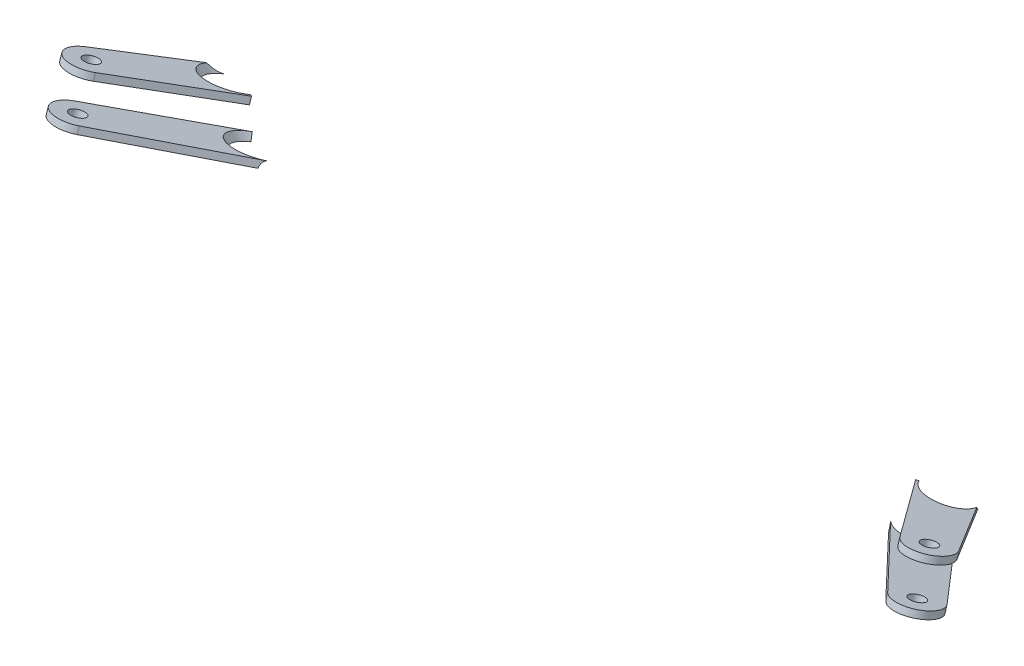
ISO-10303-21;
HEADER;
FILE_DESCRIPTION(('STEP AP214'),'2;1');
FILE_NAME('part.step','',(''),(''),'','','');
FILE_SCHEMA(('AUTOMOTIVE_DESIGN { 1 0 10303 214 1 1 1 1 }'));
ENDSEC;
DATA;
#1=APPLICATION_CONTEXT('core data for automotive mechanical design processes');
#2=APPLICATION_PROTOCOL_DEFINITION('international standard','automotive_design',2000,#1);
#3=PRODUCT_CONTEXT('',#1,'mechanical');
#4=PRODUCT('Part','Part','',(#3));
#5=PRODUCT_RELATED_PRODUCT_CATEGORY('part','',(#4));
#6=PRODUCT_DEFINITION_FORMATION('','',#4);
#7=PRODUCT_DEFINITION_CONTEXT('part definition',#1,'design');
#8=PRODUCT_DEFINITION('design','',#6,#7);
#9=PRODUCT_DEFINITION_SHAPE('','',#8);
#10=(LENGTH_UNIT() NAMED_UNIT(*) SI_UNIT(.MILLI.,.METRE.));
#11=(NAMED_UNIT(*) PLANE_ANGLE_UNIT() SI_UNIT($,.RADIAN.));
#12=(NAMED_UNIT(*) SI_UNIT($,.STERADIAN.) SOLID_ANGLE_UNIT());
#13=UNCERTAINTY_MEASURE_WITH_UNIT(LENGTH_MEASURE(1.E-05),#10,'distance_accuracy_value','');
#14=(GEOMETRIC_REPRESENTATION_CONTEXT(3) GLOBAL_UNCERTAINTY_ASSIGNED_CONTEXT((#13)) GLOBAL_UNIT_ASSIGNED_CONTEXT((#10,
#11,#12)) REPRESENTATION_CONTEXT('',''));
#15=CARTESIAN_POINT('',(0.,0.,0.));
#16=DIRECTION('',(0.,0.,1.));
#17=DIRECTION('',(1.,0.,0.));
#18=AXIS2_PLACEMENT_3D('',#15,#16,#17);
#19=CARTESIAN_POINT('',(-235.249767530379,266.790494678215,-675.844391099445));
#20=DIRECTION('',(0.0180337567061333,0.953754896880129,-0.300043963939017));
#21=DIRECTION('',(0.,0.300092765448664,0.953910023076271));
#22=AXIS2_PLACEMENT_3D('',#19,#20,#21);
#23=PLANE('',#22);
#24=CARTESIAN_POINT('',(-182.899239072118,248.763703608572,-730.));
#25=DIRECTION('',(-0.0180337567061333,-0.953754896880129,0.300043963939017));
#26=DIRECTION('',(-0.90053147748498,0.145880488564538,0.409587525585059));
#27=AXIS2_PLACEMENT_3D('',#24,#25,#26);
#28=ELLIPSE('',#27,15.7430407277131,12.7);
#29=CARTESIAN_POINT('',(-195.899982354414,247.510508125763,-734.764946946639));
#30=VERTEX_POINT('',#29);
#31=CARTESIAN_POINT('',(-176.589048516861,251.966171986454,-719.44099292264));
#32=VERTEX_POINT('',#31);
#33=EDGE_CURVE('E55',#30,#32,#28,.F.);
#34=ORIENTED_EDGE('',*,*,#33,.T.);
#35=DIRECTION('',(0.677029918290957,-0.23247307188389,-0.698274129971753));
#36=VECTOR('',#35,1.);
#37=CARTESIAN_POINT('',(-174.234426061505,251.157660721981,-721.869499997447));
#38=LINE('',#37,#36);
#39=CARTESIAN_POINT('',(-226.420953376511,269.077049493598,-668.045435546764));
#40=VERTEX_POINT('',#39);
#41=EDGE_CURVE('E95',#40,#32,#38,.T.);
#42=ORIENTED_EDGE('',*,*,#41,.F.);
#43=CARTESIAN_POINT('',(-235.249767530379,266.790494678215,-675.844391099445));
#44=DIRECTION('',(0.0180337567061333,0.953754896880129,-0.300043963939017));
#45=DIRECTION('',(0.,0.300092765448664,0.953910023076271));
#46=AXIS2_PLACEMENT_3D('',#43,#44,#45);
#47=CIRCLE('',#46,11.9999999999999);
#48=CARTESIAN_POINT('',(-244.332821935667,264.593936031197,-683.372555070879));
#49=VERTEX_POINT('',#48);
#50=EDGE_CURVE('E101',#49,#40,#47,.T.);
#51=ORIENTED_EDGE('',*,*,#50,.F.);
#52=DIRECTION('',(-0.653257284645626,0.23842306049508,0.718616284453381));
#53=VECTOR('',#52,1.);
#54=CARTESIAN_POINT('',(-197.012615797196,247.323208806299,-735.427191910088));
#55=LINE('',#54,#53);
#56=CARTESIAN_POINT('',(-197.012615797196,247.323208806299,-735.427191910088));
#57=VERTEX_POINT('',#56);
#58=EDGE_CURVE('E120',#57,#49,#55,.T.);
#59=ORIENTED_EDGE('',*,*,#58,.F.);
#60=DIRECTION('',(-0.850453631926347,-0.143164298654907,-0.506194234986862));
#61=VECTOR('',#60,1.);
#62=CARTESIAN_POINT('',(-174.234426061505,251.157660721981,-721.869499997447));
#63=LINE('',#62,#61);
#64=EDGE_CURVE('E49',#30,#57,#63,.T.);
#65=ORIENTED_EDGE('',*,*,#64,.F.);
#66=EDGE_LOOP('',(#34,#42,#51,#59,#65));
#67=FACE_BOUND('',#66,.T.);
#68=CARTESIAN_POINT('',(-235.249767530379,266.790494678215,-675.844391099445));
#69=DIRECTION('',(0.0180337567061333,0.953754896880129,-0.300043963939017));
#70=DIRECTION('',(0.,-0.300092765448664,-0.953910023076271));
#71=AXIS2_PLACEMENT_3D('',#68,#69,#70);
#72=CIRCLE('',#71,4.20000000000006);
#73=CARTESIAN_POINT('',(-235.249767530379,265.530105063331,-679.850813196365));
#74=VERTEX_POINT('',#73);
#75=EDGE_CURVE('E108',#74,#74,#72,.T.);
#76=ORIENTED_EDGE('',*,*,#75,.T.);
#77=EDGE_LOOP('',(#76));
#78=FACE_BOUND('',#77,.T.);
#79=ADVANCED_FACE('F46',(#67,#78),#23,.F.);
#80=CARTESIAN_POINT('',(-235.180337567061,270.462451031204,-676.99956036061));
#81=DIRECTION('',(0.0180337567061333,0.953754896880129,-0.300043963939017));
#82=DIRECTION('',(0.,0.300092765448664,0.953910023076271));
#83=AXIS2_PLACEMENT_3D('',#80,#81,#82);
#84=PLANE('',#83);
#85=DIRECTION('',(-0.653257284645626,0.23842306049508,0.718616284453381));
#86=VECTOR('',#85,1.);
#87=CARTESIAN_POINT('',(-196.943185833878,250.995165159287,-736.582361171253));
#88=LINE('',#87,#86);
#89=CARTESIAN_POINT('',(-196.943185833878,250.995165159287,-736.582361171253));
#90=VERTEX_POINT('',#89);
#91=CARTESIAN_POINT('',(-244.263391972348,268.265892384185,-684.527724332044));
#92=VERTEX_POINT('',#91);
#93=EDGE_CURVE('E113',#90,#92,#88,.T.);
#94=ORIENTED_EDGE('',*,*,#93,.T.);
#95=CARTESIAN_POINT('',(-235.180337567061,270.462451031204,-676.99956036061));
#96=DIRECTION('',(0.0180337567061333,0.953754896880129,-0.300043963939017));
#97=DIRECTION('',(0.,0.300092765448664,0.953910023076271));
#98=AXIS2_PLACEMENT_3D('',#95,#96,#97);
#99=CIRCLE('',#98,11.9999999999999);
#100=CARTESIAN_POINT('',(-226.351523413192,272.749005846586,-669.200604807929));
#101=VERTEX_POINT('',#100);
#102=EDGE_CURVE('E132',#92,#101,#99,.T.);
#103=ORIENTED_EDGE('',*,*,#102,.T.);
#104=DIRECTION('',(0.677029918290957,-0.23247307188389,-0.698274129971753));
#105=VECTOR('',#104,1.);
#106=CARTESIAN_POINT('',(-174.164996098186,254.829617074969,-723.024669258612));
#107=LINE('',#106,#105);
#108=CARTESIAN_POINT('',(-174.164996098186,254.829617074969,-723.024669258612));
#109=VERTEX_POINT('',#108);
#110=EDGE_CURVE('E123',#101,#109,#107,.T.);
#111=ORIENTED_EDGE('',*,*,#110,.T.);
#112=CARTESIAN_POINT('',(-185.369599059717,252.847090109373,-730.));
#113=DIRECTION('',(-0.0180337567061333,-0.953754896880129,0.300043963939017));
#114=DIRECTION('',(-0.90053147748498,0.145880488564538,0.409587525585059));
#115=AXIS2_PLACEMENT_3D('',#112,#113,#114);
#116=ELLIPSE('',#115,15.7430407277131,12.7);
#117=EDGE_CURVE('E90',#90,#109,#116,.F.);
#118=ORIENTED_EDGE('',*,*,#117,.F.);
#119=EDGE_LOOP('',(#94,#103,#111,#118));
#120=FACE_BOUND('',#119,.T.);
#121=CARTESIAN_POINT('',(-235.180337567061,270.462451031204,-676.99956036061));
#122=DIRECTION('',(0.0180337567061333,0.953754896880129,-0.300043963939017));
#123=DIRECTION('',(0.,-0.300092765448664,-0.953910023076271));
#124=AXIS2_PLACEMENT_3D('',#121,#122,#123);
#125=CIRCLE('',#124,4.20000000000006);
#126=CARTESIAN_POINT('',(-235.180337567061,269.202061416319,-681.005982457531));
#127=VERTEX_POINT('',#126);
#128=EDGE_CURVE('E111',#127,#127,#125,.T.);
#129=ORIENTED_EDGE('',*,*,#128,.F.);
#130=EDGE_LOOP('',(#129));
#131=FACE_BOUND('',#130,.T.);
#132=ADVANCED_FACE('F138',(#120,#131),#84,.T.);
#133=CARTESIAN_POINT('',(-174.234426061505,251.157660721981,-721.869499997447));
#134=DIRECTION('',(-0.525740814054178,0.264302062549315,0.808542525888297));
#135=DIRECTION('',(-0.838354450962558,0.,-0.54512550348637));
#136=AXIS2_PLACEMENT_3D('',#133,#134,#135);
#137=PLANE('',#136);
#138=CARTESIAN_POINT('',(-185.653325327252,253.31607601288,-730.));
#139=DIRECTION('',(0.525740814054178,-0.264302062549315,-0.808542525888297));
#140=DIRECTION('',(-0.294873210239745,0.834944720807768,-0.464668810098274));
#141=AXIS2_PLACEMENT_3D('',#138,#139,#140);
#142=ELLIPSE('',#141,25.4879247678671,12.7);
#143=EDGE_CURVE('E106',#90,#30,#142,.F.);
#144=ORIENTED_EDGE('',*,*,#143,.T.);
#145=ORIENTED_EDGE('',*,*,#64,.T.);
#146=DIRECTION('',(0.0180337567061333,0.953754896880129,-0.300043963939017));
#147=VECTOR('',#146,1.);
#148=CARTESIAN_POINT('',(-197.012615797196,247.323208806299,-735.427191910088));
#149=LINE('',#148,#147);
#150=EDGE_CURVE('E62',#57,#90,#149,.T.);
#151=ORIENTED_EDGE('',*,*,#150,.T.);
#152=EDGE_LOOP('',(#144,#145,#151));
#153=FACE_BOUND('',#152,.T.);
#154=ADVANCED_FACE('F136',(#153),#137,.F.);
#155=CARTESIAN_POINT('',(-197.012615797196,247.323208806299,-735.427191910088));
#156=DIRECTION('',(0.756921200440632,0.183046553918215,0.627346997619482));
#157=DIRECTION('',(-0.63812866232523,0.,0.769929743755242));
#158=AXIS2_PLACEMENT_3D('',#155,#156,#157);
#159=PLANE('',#158);
#160=ORIENTED_EDGE('',*,*,#93,.F.);
#161=ORIENTED_EDGE('',*,*,#150,.F.);
#162=ORIENTED_EDGE('',*,*,#58,.T.);
#163=DIRECTION('',(0.0180337567061333,0.953754896880129,-0.300043963939017));
#164=VECTOR('',#163,1.);
#165=CARTESIAN_POINT('',(-244.332821935667,264.593936031197,-683.372555070879));
#166=LINE('',#165,#164);
#167=EDGE_CURVE('E128',#49,#92,#166,.T.);
#168=ORIENTED_EDGE('',*,*,#167,.T.);
#169=EDGE_LOOP('',(#160,#161,#162,#168));
#170=FACE_BOUND('',#169,.T.);
#171=ADVANCED_FACE('F140',(#170),#159,.F.);
#172=CARTESIAN_POINT('',(-235.249767530379,266.790494678215,-675.844391099445));
#173=DIRECTION('',(0.0180337567061333,0.953754896880129,-0.300043963939017));
#174=DIRECTION('',(0.,0.300092765448664,0.953910023076271));
#175=AXIS2_PLACEMENT_3D('',#172,#173,#174);
#176=CYLINDRICAL_SURFACE('',#175,11.9999999999999);
#177=ORIENTED_EDGE('',*,*,#102,.F.);
#178=ORIENTED_EDGE('',*,*,#167,.F.);
#179=ORIENTED_EDGE('',*,*,#50,.T.);
#180=DIRECTION('',(0.0180337567061333,0.953754896880129,-0.300043963939017));
#181=VECTOR('',#180,1.);
#182=CARTESIAN_POINT('',(-226.420953376511,269.077049493598,-668.045435546764));
#183=LINE('',#182,#181);
#184=EDGE_CURVE('E97',#40,#101,#183,.T.);
#185=ORIENTED_EDGE('',*,*,#184,.T.);
#186=EDGE_LOOP('',(#177,#178,#179,#185));
#187=FACE_BOUND('',#186,.T.);
#188=ADVANCED_FACE('F142',(#187),#176,.T.);
#189=CARTESIAN_POINT('',(-174.234426061505,251.157660721981,-721.869499997447));
#190=DIRECTION('',(-0.735734512822393,-0.19054623461523,-0.649912962723435));
#191=DIRECTION('',(0.662042762940673,0.,-0.749466063299653));
#192=AXIS2_PLACEMENT_3D('',#189,#190,#191);
#193=PLANE('',#192);
#194=CARTESIAN_POINT('',(-154.106174529814,201.170149770705,-730.));
#195=DIRECTION('',(0.735734512822393,0.19054623461523,0.649912962723435));
#196=DIRECTION('',(-0.366171047210188,0.91917573151594,0.145033578102215));
#197=AXIS2_PLACEMENT_3D('',#194,#195,#196);
#198=ELLIPSE('',#197,58.310072412481,12.7);
#199=EDGE_CURVE('E12',#32,#109,#198,.F.);
#200=ORIENTED_EDGE('',*,*,#199,.T.);
#201=ORIENTED_EDGE('',*,*,#110,.F.);
#202=ORIENTED_EDGE('',*,*,#184,.F.);
#203=ORIENTED_EDGE('',*,*,#41,.T.);
#204=EDGE_LOOP('',(#200,#201,#202,#203));
#205=FACE_BOUND('',#204,.T.);
#206=ADVANCED_FACE('F96',(#205),#193,.F.);
#207=CARTESIAN_POINT('',(-235.249767530379,266.790494678215,-675.844391099445));
#208=DIRECTION('',(0.0180337567061333,0.953754896880129,-0.300043963939017));
#209=DIRECTION('',(0.,0.300092765448664,0.953910023076271));
#210=AXIS2_PLACEMENT_3D('',#207,#208,#209);
#211=CYLINDRICAL_SURFACE('',#210,4.20000000000006);
#212=ORIENTED_EDGE('',*,*,#75,.F.);
#213=EDGE_LOOP('',(#212));
#214=FACE_BOUND('',#213,.T.);
#215=ORIENTED_EDGE('',*,*,#128,.T.);
#216=EDGE_LOOP('',(#215));
#217=FACE_BOUND('',#216,.T.);
#218=ADVANCED_FACE('F149',(#214,#217),#211,.F.);
#219=CARTESIAN_POINT('',(-105.,120.,-730.));
#220=DIRECTION('',(-0.517624253172971,0.855608048423531,0.));
#221=DIRECTION('',(-0.855608048423532,-0.517624253172971,0.));
#222=AXIS2_PLACEMENT_3D('',#219,#220,#221);
#223=CYLINDRICAL_SURFACE('',#222,12.7);
#224=ORIENTED_EDGE('',*,*,#143,.F.);
#225=ORIENTED_EDGE('',*,*,#117,.T.);
#226=ORIENTED_EDGE('',*,*,#199,.F.);
#227=ORIENTED_EDGE('',*,*,#33,.F.);
#228=EDGE_LOOP('',(#224,#225,#226,#227));
#229=FACE_BOUND('',#228,.T.);
#230=ADVANCED_FACE('F87',(#229),#223,.F.);
#231=CLOSED_SHELL('',(#79,#132,#154,#171,#188,#206,#218,#230));
#232=MANIFOLD_SOLID_BREP('B2',#231);
#233=CARTESIAN_POINT('',(-234.75023246962,293.209505321791,-684.155608900555));
#234=DIRECTION('',(0.0180337567061333,0.953754896880127,-0.300043963939024));
#235=DIRECTION('',(0.,0.300092765448671,0.953910023076269));
#236=AXIS2_PLACEMENT_3D('',#233,#234,#235);
#237=PLANE('',#236);
#238=DIRECTION('',(0.575310780054983,-0.255335033847021,-0.777059538801801));
#239=VECTOR('',#238,1.);
#240=CARTESIAN_POINT('',(-210.728681196313,276.289830752568,-736.49468433631));
#241=LINE('',#240,#239);
#242=CARTESIAN_POINT('',(-244.563065381471,291.306242630484,-690.795330383567));
#243=VERTEX_POINT('',#242);
#244=CARTESIAN_POINT('',(-215.736454754987,278.512386066029,-729.7307954143));
#245=VERTEX_POINT('',#244);
#246=EDGE_CURVE('E277',#243,#245,#241,.T.);
#247=ORIENTED_EDGE('',*,*,#246,.F.);
#248=CARTESIAN_POINT('',(-234.75023246962,293.209505321791,-684.155608900555));
#249=DIRECTION('',(-0.0180337567061333,-0.953754896880127,0.300043963939024));
#250=DIRECTION('',(0.,0.300092765448671,0.953910023076269));
#251=AXIS2_PLACEMENT_3D('',#248,#249,#250);
#252=CIRCLE('',#251,11.9999999999999);
#253=CARTESIAN_POINT('',(-225.266604592974,295.252202335684,-677.092451589073));
#254=VERTEX_POINT('',#253);
#255=EDGE_CURVE('E288',#254,#243,#252,.T.);
#256=ORIENTED_EDGE('',*,*,#255,.F.);
#257=DIRECTION('',(-0.612451648536317,0.247740046763646,0.750684918880548));
#258=VECTOR('',#257,1.);
#259=CARTESIAN_POINT('',(-185.991476826681,279.365198010162,-725.232163796109));
#260=LINE('',#259,#258);
#261=CARTESIAN_POINT('',(-185.991476826681,279.365198010162,-725.232163796109));
#262=VERTEX_POINT('',#261);
#263=EDGE_CURVE('E291',#262,#254,#260,.T.);
#264=ORIENTED_EDGE('',*,*,#263,.F.);
#265=DIRECTION('',(0.904341818060462,0.112429164402669,0.411734816476353));
#266=VECTOR('',#265,1.);
#267=CARTESIAN_POINT('',(-185.991476826681,279.365198010162,-725.232163796109));
#268=LINE('',#267,#266);
#269=CARTESIAN_POINT('',(-187.295724205294,279.20305197199,-725.825970301955));
#270=VERTEX_POINT('',#269);
#271=EDGE_CURVE('E226',#270,#262,#268,.T.);
#272=ORIENTED_EDGE('',*,*,#271,.F.);
#273=CARTESIAN_POINT('',(-200.672997943935,278.142874016926,-730.));
#274=DIRECTION('',(-0.0180337567061333,-0.953754896880127,0.300043963939024));
#275=DIRECTION('',(-0.900531477484976,0.145880488564543,0.409587525585066));
#276=AXIS2_PLACEMENT_3D('',#273,#274,#275);
#277=ELLIPSE('',#276,15.7430407277132,12.7);
#278=EDGE_CURVE('E265',#245,#270,#277,.F.);
#279=ORIENTED_EDGE('',*,*,#278,.F.);
#280=EDGE_LOOP('',(#247,#256,#264,#272,#279));
#281=FACE_BOUND('',#280,.T.);
#282=CARTESIAN_POINT('',(-234.75023246962,293.209505321791,-684.155608900555));
#283=DIRECTION('',(-0.0180337567061333,-0.953754896880127,0.300043963939024));
#284=DIRECTION('',(0.,0.300092765448671,0.953910023076269));
#285=AXIS2_PLACEMENT_3D('',#282,#283,#284);
#286=CIRCLE('',#285,4.20000000000001);
#287=CARTESIAN_POINT('',(-234.75023246962,294.469894936675,-680.149186803635));
#288=VERTEX_POINT('',#287);
#289=EDGE_CURVE('E296',#288,#288,#286,.T.);
#290=ORIENTED_EDGE('',*,*,#289,.T.);
#291=EDGE_LOOP('',(#290));
#292=FACE_BOUND('',#291,.T.);
#293=ADVANCED_FACE('F223',(#281,#292),#237,.T.);
#294=CARTESIAN_POINT('',(-234.819662432938,289.537548968802,-683.00043963939));
#295=DIRECTION('',(0.0180337567061333,0.953754896880127,-0.300043963939024));
#296=DIRECTION('',(0.,0.300092765448671,0.953910023076269));
#297=AXIS2_PLACEMENT_3D('',#294,#295,#296);
#298=PLANE('',#297);
#299=CARTESIAN_POINT('',(-198.202637956335,274.059487516125,-730.));
#300=DIRECTION('',(-0.0180337567061333,-0.953754896880127,0.300043963939024));
#301=DIRECTION('',(-0.900531477484976,0.145880488564543,0.409587525585066));
#302=AXIS2_PLACEMENT_3D('',#299,#300,#301);
#303=ELLIPSE('',#302,15.7430407277132,12.7);
#304=CARTESIAN_POINT('',(-210.798111159632,272.617874399579,-735.339515075145));
#305=VERTEX_POINT('',#304);
#306=CARTESIAN_POINT('',(-186.060906789999,275.693241657173,-724.076994534944));
#307=VERTEX_POINT('',#306);
#308=EDGE_CURVE('E44',#305,#307,#303,.F.);
#309=ORIENTED_EDGE('',*,*,#308,.T.);
#310=DIRECTION('',(-0.612451648536317,0.247740046763646,0.750684918880548));
#311=VECTOR('',#310,1.);
#312=CARTESIAN_POINT('',(-186.060906789999,275.693241657173,-724.076994534944));
#313=LINE('',#312,#311);
#314=CARTESIAN_POINT('',(-225.336034556293,291.580245982696,-675.937282327907));
#315=VERTEX_POINT('',#314);
#316=EDGE_CURVE('E286',#307,#315,#313,.T.);
#317=ORIENTED_EDGE('',*,*,#316,.T.);
#318=CARTESIAN_POINT('',(-234.819662432938,289.537548968802,-683.00043963939));
#319=DIRECTION('',(-0.0180337567061333,-0.953754896880127,0.300043963939024));
#320=DIRECTION('',(0.,0.300092765448671,0.953910023076269));
#321=AXIS2_PLACEMENT_3D('',#318,#319,#320);
#322=CIRCLE('',#321,11.9999999999999);
#323=CARTESIAN_POINT('',(-244.632495344789,287.634286277495,-689.640161122401));
#324=VERTEX_POINT('',#323);
#325=EDGE_CURVE('E311',#315,#324,#322,.T.);
#326=ORIENTED_EDGE('',*,*,#325,.T.);
#327=DIRECTION('',(0.575310780054983,-0.255335033847021,-0.777059538801801));
#328=VECTOR('',#327,1.);
#329=CARTESIAN_POINT('',(-210.798111159632,272.61787439958,-735.339515075145));
#330=LINE('',#329,#328);
#331=EDGE_CURVE('E299',#324,#305,#330,.T.);
#332=ORIENTED_EDGE('',*,*,#331,.T.);
#333=EDGE_LOOP('',(#309,#317,#326,#332));
#334=FACE_BOUND('',#333,.T.);
#335=CARTESIAN_POINT('',(-234.819662432938,289.537548968802,-683.00043963939));
#336=DIRECTION('',(-0.0180337567061333,-0.953754896880127,0.300043963939024));
#337=DIRECTION('',(0.,0.300092765448671,0.953910023076269));
#338=AXIS2_PLACEMENT_3D('',#335,#336,#337);
#339=CIRCLE('',#338,4.20000000000001);
#340=CARTESIAN_POINT('',(-234.819662432938,290.797938583687,-678.994017542469));
#341=VERTEX_POINT('',#340);
#342=EDGE_CURVE('E290',#341,#341,#339,.T.);
#343=ORIENTED_EDGE('',*,*,#342,.F.);
#344=EDGE_LOOP('',(#343));
#345=FACE_BOUND('',#344,.T.);
#346=ADVANCED_FACE('F309',(#334,#345),#298,.F.);
#347=CARTESIAN_POINT('',(-185.991476826681,279.365198010162,-725.232163796109));
#348=DIRECTION('',(-0.426427789580091,0.278767429354463,0.860492917231131));
#349=DIRECTION('',(-0.896012052199937,0.,-0.444029731338406));
#350=AXIS2_PLACEMENT_3D('',#347,#348,#349);
#351=PLANE('',#350);
#352=CARTESIAN_POINT('',(-198.624823422313,274.757339829659,-730.));
#353=DIRECTION('',(0.426427789580091,-0.278767429354463,-0.860492917231131));
#354=DIRECTION('',(-0.362249153198803,0.819067433910312,-0.444864125002598));
#355=AXIS2_PLACEMENT_3D('',#352,#353,#354);
#356=ELLIPSE('',#355,27.6540830778853,12.7);
#357=EDGE_CURVE('E271',#307,#270,#356,.F.);
#358=ORIENTED_EDGE('',*,*,#357,.T.);
#359=ORIENTED_EDGE('',*,*,#271,.T.);
#360=DIRECTION('',(-0.0180337567061333,-0.953754896880127,0.300043963939024));
#361=VECTOR('',#360,1.);
#362=CARTESIAN_POINT('',(-185.991476826681,279.365198010162,-725.232163796109));
#363=LINE('',#362,#361);
#364=EDGE_CURVE('E238',#262,#307,#363,.T.);
#365=ORIENTED_EDGE('',*,*,#364,.T.);
#366=EDGE_LOOP('',(#358,#359,#365));
#367=FACE_BOUND('',#366,.T.);
#368=ADVANCED_FACE('F300',(#367),#351,.F.);
#369=CARTESIAN_POINT('',(-185.991476826681,279.365198010162,-725.232163796109));
#370=DIRECTION('',(-0.790302323053787,-0.170224751157771,-0.58859644262352));
#371=DIRECTION('',(0.597314084057812,0.,-0.802007409558152));
#372=AXIS2_PLACEMENT_3D('',#369,#370,#371);
#373=PLANE('',#372);
#374=ORIENTED_EDGE('',*,*,#316,.F.);
#375=ORIENTED_EDGE('',*,*,#364,.F.);
#376=ORIENTED_EDGE('',*,*,#263,.T.);
#377=DIRECTION('',(-0.0180337567061333,-0.953754896880127,0.300043963939024));
#378=VECTOR('',#377,1.);
#379=CARTESIAN_POINT('',(-225.266604592974,295.252202335684,-677.092451589073));
#380=LINE('',#379,#378);
#381=EDGE_CURVE('E305',#254,#315,#380,.T.);
#382=ORIENTED_EDGE('',*,*,#381,.T.);
#383=EDGE_LOOP('',(#374,#375,#376,#382));
#384=FACE_BOUND('',#383,.T.);
#385=ADVANCED_FACE('F304',(#384),#373,.F.);
#386=CARTESIAN_POINT('',(-234.75023246962,293.209505321791,-684.155608900555));
#387=DIRECTION('',(-0.0180337567061333,-0.953754896880127,0.300043963939024));
#388=DIRECTION('',(0.,-0.300092765448671,-0.953910023076269));
#389=AXIS2_PLACEMENT_3D('',#386,#387,#388);
#390=CYLINDRICAL_SURFACE('',#389,11.9999999999999);
#391=ORIENTED_EDGE('',*,*,#325,.F.);
#392=ORIENTED_EDGE('',*,*,#381,.F.);
#393=ORIENTED_EDGE('',*,*,#255,.T.);
#394=DIRECTION('',(-0.0180337567061333,-0.953754896880127,0.300043963939024));
#395=VECTOR('',#394,1.);
#396=CARTESIAN_POINT('',(-244.563065381471,291.306242630484,-690.795330383567));
#397=LINE('',#396,#395);
#398=EDGE_CURVE('E281',#243,#324,#397,.T.);
#399=ORIENTED_EDGE('',*,*,#398,.T.);
#400=EDGE_LOOP('',(#391,#392,#393,#399));
#401=FACE_BOUND('',#400,.T.);
#402=ADVANCED_FACE('F317',(#401),#390,.T.);
#403=CARTESIAN_POINT('',(-210.728681196313,276.289830752568,-736.49468433631));
#404=DIRECTION('',(0.817736075987595,0.158605224275617,0.553310123584316));
#405=DIRECTION('',(-0.560403668416996,0.,0.828219613644095));
#406=AXIS2_PLACEMENT_3D('',#403,#404,#405);
#407=PLANE('',#406);
#408=CARTESIAN_POINT('',(-222.471129955933,314.174140086353,-730.));
#409=DIRECTION('',(-0.817736075987595,-0.158605224275617,-0.553310123584316));
#410=DIRECTION('',(-0.294921002136717,0.940967681981124,0.166136762836359));
#411=AXIS2_PLACEMENT_3D('',#408,#409,#410);
#412=ELLIPSE('',#411,44.1622205443775,12.7);
#413=EDGE_CURVE('E232',#245,#305,#412,.F.);
#414=ORIENTED_EDGE('',*,*,#413,.T.);
#415=ORIENTED_EDGE('',*,*,#331,.F.);
#416=ORIENTED_EDGE('',*,*,#398,.F.);
#417=ORIENTED_EDGE('',*,*,#246,.T.);
#418=EDGE_LOOP('',(#414,#415,#416,#417));
#419=FACE_BOUND('',#418,.T.);
#420=ADVANCED_FACE('F280',(#419),#407,.F.);
#421=CARTESIAN_POINT('',(-234.75023246962,293.209505321791,-684.155608900555));
#422=DIRECTION('',(-0.0180337567061333,-0.953754896880127,0.300043963939024));
#423=DIRECTION('',(0.,-0.300092765448671,-0.953910023076269));
#424=AXIS2_PLACEMENT_3D('',#421,#422,#423);
#425=CYLINDRICAL_SURFACE('',#424,4.20000000000001);
#426=ORIENTED_EDGE('',*,*,#289,.F.);
#427=EDGE_LOOP('',(#426));
#428=FACE_BOUND('',#427,.T.);
#429=ORIENTED_EDGE('',*,*,#342,.T.);
#430=EDGE_LOOP('',(#429));
#431=FACE_BOUND('',#430,.T.);
#432=ADVANCED_FACE('F324',(#428,#431),#425,.F.);
#433=CARTESIAN_POINT('',(-105.,120.,-730.));
#434=DIRECTION('',(-0.517624253172971,0.855608048423531,0.));
#435=DIRECTION('',(-0.855608048423532,-0.517624253172971,0.));
#436=AXIS2_PLACEMENT_3D('',#433,#434,#435);
#437=CYLINDRICAL_SURFACE('',#436,12.7);
#438=ORIENTED_EDGE('',*,*,#357,.F.);
#439=ORIENTED_EDGE('',*,*,#308,.F.);
#440=ORIENTED_EDGE('',*,*,#413,.F.);
#441=ORIENTED_EDGE('',*,*,#278,.T.);
#442=EDGE_LOOP('',(#438,#439,#440,#441));
#443=FACE_BOUND('',#442,.T.);
#444=ADVANCED_FACE('F264',(#443),#437,.F.);
#445=CLOSED_SHELL('',(#293,#346,#368,#385,#402,#420,#432,#444));
#446=MANIFOLD_SOLID_BREP('B6',#445);
#447=CARTESIAN_POINT('',(235.249767530379,266.790494678215,-675.844391099445));
#448=DIRECTION('',(-0.0180337567061333,0.953754896880129,-0.300043963939017));
#449=DIRECTION('',(0.,0.300092765448664,0.953910023076271));
#450=AXIS2_PLACEMENT_3D('',#447,#448,#449);
#451=PLANE('',#450);
#452=CARTESIAN_POINT('',(182.899239072118,248.763703608572,-730.));
#453=DIRECTION('',(-0.0180337567061333,0.953754896880129,-0.300043963939017));
#454=DIRECTION('',(0.90053147748498,0.145880488564538,0.409587525585059));
#455=AXIS2_PLACEMENT_3D('',#452,#453,#454);
#456=ELLIPSE('',#455,15.7430407277131,12.7);
#457=CARTESIAN_POINT('',(195.899982354414,247.510508125763,-734.764946946639));
#458=VERTEX_POINT('',#457);
#459=CARTESIAN_POINT('',(176.589048516861,251.966171986454,-719.44099292264));
#460=VERTEX_POINT('',#459);
#461=EDGE_CURVE('E408',#458,#460,#456,.F.);
#462=ORIENTED_EDGE('',*,*,#461,.F.);
#463=DIRECTION('',(0.850453631926347,-0.143164298654907,-0.506194234986862));
#464=VECTOR('',#463,1.);
#465=CARTESIAN_POINT('',(174.234426061505,251.157660721981,-721.869499997447));
#466=LINE('',#465,#464);
#467=CARTESIAN_POINT('',(197.012615797196,247.323208806299,-735.427191910088));
#468=VERTEX_POINT('',#467);
#469=EDGE_CURVE('E402',#458,#468,#466,.T.);
#470=ORIENTED_EDGE('',*,*,#469,.T.);
#471=DIRECTION('',(0.653257284645626,0.23842306049508,0.718616284453381));
#472=VECTOR('',#471,1.);
#473=CARTESIAN_POINT('',(197.012615797196,247.323208806299,-735.427191910088));
#474=LINE('',#473,#472);
#475=CARTESIAN_POINT('',(244.332821935667,264.593936031197,-683.372555070879));
#476=VERTEX_POINT('',#475);
#477=EDGE_CURVE('E458',#468,#476,#474,.T.);
#478=ORIENTED_EDGE('',*,*,#477,.T.);
#479=CARTESIAN_POINT('',(235.249767530379,266.790494678215,-675.844391099445));
#480=DIRECTION('',(0.0180337567061333,-0.953754896880129,0.300043963939017));
#481=DIRECTION('',(0.,0.300092765448664,0.953910023076271));
#482=AXIS2_PLACEMENT_3D('',#479,#480,#481);
#483=CIRCLE('',#482,11.9999999999999);
#484=CARTESIAN_POINT('',(226.420953376511,269.077049493598,-668.045435546764));
#485=VERTEX_POINT('',#484);
#486=EDGE_CURVE('E454',#476,#485,#483,.T.);
#487=ORIENTED_EDGE('',*,*,#486,.T.);
#488=DIRECTION('',(-0.677029918290957,-0.23247307188389,-0.698274129971753));
#489=VECTOR('',#488,1.);
#490=CARTESIAN_POINT('',(174.234426061505,251.157660721981,-721.869499997447));
#491=LINE('',#490,#489);
#492=EDGE_CURVE('E449',#485,#460,#491,.T.);
#493=ORIENTED_EDGE('',*,*,#492,.T.);
#494=EDGE_LOOP('',(#462,#470,#478,#487,#493));
#495=FACE_BOUND('',#494,.T.);
#496=CARTESIAN_POINT('',(235.249767530379,266.790494678215,-675.844391099445));
#497=DIRECTION('',(0.0180337567061333,-0.953754896880129,0.300043963939017));
#498=DIRECTION('',(0.,-0.300092765448664,-0.953910023076271));
#499=AXIS2_PLACEMENT_3D('',#496,#497,#498);
#500=CIRCLE('',#499,4.20000000000006);
#501=CARTESIAN_POINT('',(235.249767530379,265.530105063331,-679.850813196365));
#502=VERTEX_POINT('',#501);
#503=EDGE_CURVE('E467',#502,#502,#500,.T.);
#504=ORIENTED_EDGE('',*,*,#503,.F.);
#505=EDGE_LOOP('',(#504));
#506=FACE_BOUND('',#505,.T.);
#507=ADVANCED_FACE('F399',(#495,#506),#451,.F.);
#508=CARTESIAN_POINT('',(235.180337567061,270.462451031204,-676.99956036061));
#509=DIRECTION('',(-0.0180337567061333,0.953754896880129,-0.300043963939017));
#510=DIRECTION('',(0.,0.300092765448664,0.953910023076271));
#511=AXIS2_PLACEMENT_3D('',#508,#509,#510);
#512=PLANE('',#511);
#513=DIRECTION('',(0.653257284645626,0.23842306049508,0.718616284453381));
#514=VECTOR('',#513,1.);
#515=CARTESIAN_POINT('',(196.943185833878,250.995165159287,-736.582361171253));
#516=LINE('',#515,#514);
#517=CARTESIAN_POINT('',(196.943185833878,250.995165159287,-736.582361171253));
#518=VERTEX_POINT('',#517);
#519=CARTESIAN_POINT('',(244.263391972348,268.265892384185,-684.527724332044));
#520=VERTEX_POINT('',#519);
#521=EDGE_CURVE('E461',#518,#520,#516,.T.);
#522=ORIENTED_EDGE('',*,*,#521,.F.);
#523=CARTESIAN_POINT('',(185.369599059717,252.847090109373,-730.));
#524=DIRECTION('',(-0.0180337567061333,0.953754896880129,-0.300043963939017));
#525=DIRECTION('',(0.90053147748498,0.145880488564538,0.409587525585059));
#526=AXIS2_PLACEMENT_3D('',#523,#524,#525);
#527=ELLIPSE('',#526,15.7430407277131,12.7);
#528=CARTESIAN_POINT('',(174.164996098186,254.829617074969,-723.024669258612));
#529=VERTEX_POINT('',#528);
#530=EDGE_CURVE('E414',#518,#529,#527,.F.);
#531=ORIENTED_EDGE('',*,*,#530,.T.);
#532=DIRECTION('',(-0.677029918290957,-0.23247307188389,-0.698274129971753));
#533=VECTOR('',#532,1.);
#534=CARTESIAN_POINT('',(174.164996098186,254.829617074969,-723.024669258612));
#535=LINE('',#534,#533);
#536=CARTESIAN_POINT('',(226.351523413192,272.749005846586,-669.200604807929));
#537=VERTEX_POINT('',#536);
#538=EDGE_CURVE('E451',#537,#529,#535,.T.);
#539=ORIENTED_EDGE('',*,*,#538,.F.);
#540=CARTESIAN_POINT('',(235.180337567061,270.462451031204,-676.99956036061));
#541=DIRECTION('',(0.0180337567061333,-0.953754896880129,0.300043963939017));
#542=DIRECTION('',(0.,0.300092765448664,0.953910023076271));
#543=AXIS2_PLACEMENT_3D('',#540,#541,#542);
#544=CIRCLE('',#543,11.9999999999999);
#545=EDGE_CURVE('E477',#520,#537,#544,.T.);
#546=ORIENTED_EDGE('',*,*,#545,.F.);
#547=EDGE_LOOP('',(#522,#531,#539,#546));
#548=FACE_BOUND('',#547,.T.);
#549=CARTESIAN_POINT('',(235.180337567061,270.462451031204,-676.99956036061));
#550=DIRECTION('',(0.0180337567061333,-0.953754896880129,0.300043963939017));
#551=DIRECTION('',(0.,-0.300092765448664,-0.953910023076271));
#552=AXIS2_PLACEMENT_3D('',#549,#550,#551);
#553=CIRCLE('',#552,4.20000000000006);
#554=CARTESIAN_POINT('',(235.180337567061,269.202061416319,-681.005982457531));
#555=VERTEX_POINT('',#554);
#556=EDGE_CURVE('E457',#555,#555,#553,.T.);
#557=ORIENTED_EDGE('',*,*,#556,.T.);
#558=EDGE_LOOP('',(#557));
#559=FACE_BOUND('',#558,.T.);
#560=ADVANCED_FACE('F492',(#548,#559),#512,.T.);
#561=CARTESIAN_POINT('',(174.234426061505,251.157660721981,-721.869499997447));
#562=DIRECTION('',(0.525740814054178,0.264302062549315,0.808542525888297));
#563=DIRECTION('',(0.838354450962558,0.,-0.54512550348637));
#564=AXIS2_PLACEMENT_3D('',#561,#562,#563);
#565=PLANE('',#564);
#566=CARTESIAN_POINT('',(185.653325327252,253.31607601288,-730.));
#567=DIRECTION('',(0.525740814054178,0.264302062549315,0.808542525888297));
#568=DIRECTION('',(0.294873210239745,0.834944720807768,-0.464668810098274));
#569=AXIS2_PLACEMENT_3D('',#566,#567,#568);
#570=ELLIPSE('',#569,25.4879247678671,12.7);
#571=EDGE_CURVE('E439',#518,#458,#570,.F.);
#572=ORIENTED_EDGE('',*,*,#571,.F.);
#573=DIRECTION('',(-0.0180337567061333,0.953754896880129,-0.300043963939017));
#574=VECTOR('',#573,1.);
#575=CARTESIAN_POINT('',(197.012615797196,247.323208806299,-735.427191910088));
#576=LINE('',#575,#574);
#577=EDGE_CURVE('E478',#468,#518,#576,.T.);
#578=ORIENTED_EDGE('',*,*,#577,.F.);
#579=ORIENTED_EDGE('',*,*,#469,.F.);
#580=EDGE_LOOP('',(#572,#578,#579));
#581=FACE_BOUND('',#580,.T.);
#582=ADVANCED_FACE('F495',(#581),#565,.F.);
#583=CARTESIAN_POINT('',(197.012615797196,247.323208806299,-735.427191910088));
#584=DIRECTION('',(-0.756921200440632,0.183046553918215,0.627346997619482));
#585=DIRECTION('',(0.63812866232523,0.,0.769929743755242));
#586=AXIS2_PLACEMENT_3D('',#583,#584,#585);
#587=PLANE('',#586);
#588=ORIENTED_EDGE('',*,*,#521,.T.);
#589=DIRECTION('',(-0.0180337567061333,0.953754896880129,-0.300043963939017));
#590=VECTOR('',#589,1.);
#591=CARTESIAN_POINT('',(244.332821935667,264.593936031197,-683.372555070879));
#592=LINE('',#591,#590);
#593=EDGE_CURVE('E474',#476,#520,#592,.T.);
#594=ORIENTED_EDGE('',*,*,#593,.F.);
#595=ORIENTED_EDGE('',*,*,#477,.F.);
#596=ORIENTED_EDGE('',*,*,#577,.T.);
#597=EDGE_LOOP('',(#588,#594,#595,#596));
#598=FACE_BOUND('',#597,.T.);
#599=ADVANCED_FACE('F489',(#598),#587,.F.);
#600=CARTESIAN_POINT('',(235.249767530379,266.790494678215,-675.844391099445));
#601=DIRECTION('',(-0.0180337567061333,0.953754896880129,-0.300043963939017));
#602=DIRECTION('',(0.,0.300092765448664,0.953910023076271));
#603=AXIS2_PLACEMENT_3D('',#600,#601,#602);
#604=CYLINDRICAL_SURFACE('',#603,11.9999999999999);
#605=ORIENTED_EDGE('',*,*,#545,.T.);
#606=DIRECTION('',(-0.0180337567061333,0.953754896880129,-0.300043963939017));
#607=VECTOR('',#606,1.);
#608=CARTESIAN_POINT('',(226.420953376511,269.077049493598,-668.045435546764));
#609=LINE('',#608,#607);
#610=EDGE_CURVE('E472',#485,#537,#609,.T.);
#611=ORIENTED_EDGE('',*,*,#610,.F.);
#612=ORIENTED_EDGE('',*,*,#486,.F.);
#613=ORIENTED_EDGE('',*,*,#593,.T.);
#614=EDGE_LOOP('',(#605,#611,#612,#613));
#615=FACE_BOUND('',#614,.T.);
#616=ADVANCED_FACE('F491',(#615),#604,.T.);
#617=CARTESIAN_POINT('',(174.234426061505,251.157660721981,-721.869499997447));
#618=DIRECTION('',(0.735734512822393,-0.19054623461523,-0.649912962723435));
#619=DIRECTION('',(-0.662042762940673,0.,-0.749466063299653));
#620=AXIS2_PLACEMENT_3D('',#617,#618,#619);
#621=PLANE('',#620);
#622=CARTESIAN_POINT('',(154.106174529814,201.170149770705,-730.));
#623=DIRECTION('',(0.735734512822393,-0.19054623461523,-0.649912962723435));
#624=DIRECTION('',(0.366171047210188,0.91917573151594,0.145033578102215));
#625=AXIS2_PLACEMENT_3D('',#622,#623,#624);
#626=ELLIPSE('',#625,58.310072412481,12.7);
#627=EDGE_CURVE('E221',#460,#529,#626,.F.);
#628=ORIENTED_EDGE('',*,*,#627,.F.);
#629=ORIENTED_EDGE('',*,*,#492,.F.);
#630=ORIENTED_EDGE('',*,*,#610,.T.);
#631=ORIENTED_EDGE('',*,*,#538,.T.);
#632=EDGE_LOOP('',(#628,#629,#630,#631));
#633=FACE_BOUND('',#632,.T.);
#634=ADVANCED_FACE('F447',(#633),#621,.F.);
#635=CARTESIAN_POINT('',(235.249767530379,266.790494678215,-675.844391099445));
#636=DIRECTION('',(-0.0180337567061333,0.953754896880129,-0.300043963939017));
#637=DIRECTION('',(0.,0.300092765448664,0.953910023076271));
#638=AXIS2_PLACEMENT_3D('',#635,#636,#637);
#639=CYLINDRICAL_SURFACE('',#638,4.20000000000006);
#640=ORIENTED_EDGE('',*,*,#503,.T.);
#641=EDGE_LOOP('',(#640));
#642=FACE_BOUND('',#641,.T.);
#643=ORIENTED_EDGE('',*,*,#556,.F.);
#644=EDGE_LOOP('',(#643));
#645=FACE_BOUND('',#644,.T.);
#646=ADVANCED_FACE('F498',(#642,#645),#639,.F.);
#647=CARTESIAN_POINT('',(105.,120.,-730.));
#648=DIRECTION('',(0.517624253172971,0.855608048423531,0.));
#649=DIRECTION('',(0.855608048423532,-0.517624253172971,0.));
#650=AXIS2_PLACEMENT_3D('',#647,#648,#649);
#651=CYLINDRICAL_SURFACE('',#650,12.7);
#652=ORIENTED_EDGE('',*,*,#571,.T.);
#653=ORIENTED_EDGE('',*,*,#461,.T.);
#654=ORIENTED_EDGE('',*,*,#627,.T.);
#655=ORIENTED_EDGE('',*,*,#530,.F.);
#656=EDGE_LOOP('',(#652,#653,#654,#655));
#657=FACE_BOUND('',#656,.T.);
#658=ADVANCED_FACE('F438',(#657),#651,.F.);
#659=CLOSED_SHELL('',(#507,#560,#582,#599,#616,#634,#646,#658));
#660=MANIFOLD_SOLID_BREP('B38',#659);
#661=CARTESIAN_POINT('',(234.75023246962,293.209505321791,-684.155608900555));
#662=DIRECTION('',(-0.0180337567061333,0.953754896880127,-0.300043963939024));
#663=DIRECTION('',(0.,0.300092765448671,0.953910023076269));
#664=AXIS2_PLACEMENT_3D('',#661,#662,#663);
#665=PLANE('',#664);
#666=DIRECTION('',(-0.575310780054983,-0.255335033847021,-0.777059538801801));
#667=VECTOR('',#666,1.);
#668=CARTESIAN_POINT('',(210.728681196313,276.289830752568,-736.49468433631));
#669=LINE('',#668,#667);
#670=CARTESIAN_POINT('',(244.563065381471,291.306242630484,-690.795330383567));
#671=VERTEX_POINT('',#670);
#672=CARTESIAN_POINT('',(215.736454754987,278.512386066029,-729.7307954143));
#673=VERTEX_POINT('',#672);
#674=EDGE_CURVE('E609',#671,#673,#669,.T.);
#675=ORIENTED_EDGE('',*,*,#674,.T.);
#676=CARTESIAN_POINT('',(200.672997943935,278.142874016926,-730.));
#677=DIRECTION('',(-0.0180337567061333,0.953754896880127,-0.300043963939024));
#678=DIRECTION('',(0.900531477484976,0.145880488564543,0.409587525585066));
#679=AXIS2_PLACEMENT_3D('',#676,#677,#678);
#680=ELLIPSE('',#679,15.7430407277132,12.7);
#681=CARTESIAN_POINT('',(187.295724205294,279.20305197199,-725.825970301955));
#682=VERTEX_POINT('',#681);
#683=EDGE_CURVE('E602',#673,#682,#680,.F.);
#684=ORIENTED_EDGE('',*,*,#683,.T.);
#685=DIRECTION('',(-0.904341818060462,0.112429164402669,0.411734816476353));
#686=VECTOR('',#685,1.);
#687=CARTESIAN_POINT('',(185.991476826681,279.365198010162,-725.232163796109));
#688=LINE('',#687,#686);
#689=CARTESIAN_POINT('',(185.991476826681,279.365198010162,-725.232163796109));
#690=VERTEX_POINT('',#689);
#691=EDGE_CURVE('E569',#682,#690,#688,.T.);
#692=ORIENTED_EDGE('',*,*,#691,.T.);
#693=DIRECTION('',(0.612451648536317,0.247740046763646,0.750684918880548));
#694=VECTOR('',#693,1.);
#695=CARTESIAN_POINT('',(185.991476826681,279.365198010162,-725.232163796109));
#696=LINE('',#695,#694);
#697=CARTESIAN_POINT('',(225.266604592974,295.252202335684,-677.092451589073));
#698=VERTEX_POINT('',#697);
#699=EDGE_CURVE('E630',#690,#698,#696,.T.);
#700=ORIENTED_EDGE('',*,*,#699,.T.);
#701=CARTESIAN_POINT('',(234.75023246962,293.209505321791,-684.155608900555));
#702=DIRECTION('',(-0.0180337567061333,0.953754896880127,-0.300043963939024));
#703=DIRECTION('',(0.,0.300092765448671,0.953910023076269));
#704=AXIS2_PLACEMENT_3D('',#701,#702,#703);
#705=CIRCLE('',#704,11.9999999999999);
#706=EDGE_CURVE('E621',#698,#671,#705,.T.);
#707=ORIENTED_EDGE('',*,*,#706,.T.);
#708=EDGE_LOOP('',(#675,#684,#692,#700,#707));
#709=FACE_BOUND('',#708,.T.);
#710=CARTESIAN_POINT('',(234.75023246962,293.209505321791,-684.155608900555));
#711=DIRECTION('',(-0.0180337567061333,0.953754896880127,-0.300043963939024));
#712=DIRECTION('',(0.,0.300092765448671,0.953910023076269));
#713=AXIS2_PLACEMENT_3D('',#710,#711,#712);
#714=CIRCLE('',#713,4.20000000000001);
#715=CARTESIAN_POINT('',(234.75023246962,294.469894936675,-680.149186803635));
#716=VERTEX_POINT('',#715);
#717=EDGE_CURVE('E634',#716,#716,#714,.T.);
#718=ORIENTED_EDGE('',*,*,#717,.F.);
#719=EDGE_LOOP('',(#718));
#720=FACE_BOUND('',#719,.T.);
#721=ADVANCED_FACE('F566',(#709,#720),#665,.T.);
#722=CARTESIAN_POINT('',(234.819662432938,289.537548968802,-683.00043963939));
#723=DIRECTION('',(-0.0180337567061333,0.953754896880127,-0.300043963939024));
#724=DIRECTION('',(0.,0.300092765448671,0.953910023076269));
#725=AXIS2_PLACEMENT_3D('',#722,#723,#724);
#726=PLANE('',#725);
#727=CARTESIAN_POINT('',(198.202637956335,274.059487516125,-730.));
#728=DIRECTION('',(-0.0180337567061333,0.953754896880127,-0.300043963939024));
#729=DIRECTION('',(0.900531477484976,0.145880488564543,0.409587525585066));
#730=AXIS2_PLACEMENT_3D('',#727,#728,#729);
#731=ELLIPSE('',#730,15.7430407277132,12.7);
#732=CARTESIAN_POINT('',(210.798111159632,272.617874399579,-735.339515075145));
#733=VERTEX_POINT('',#732);
#734=CARTESIAN_POINT('',(186.060906789999,275.693241657173,-724.076994534944));
#735=VERTEX_POINT('',#734);
#736=EDGE_CURVE('E397',#733,#735,#731,.F.);
#737=ORIENTED_EDGE('',*,*,#736,.F.);
#738=DIRECTION('',(-0.575310780054983,-0.255335033847021,-0.777059538801801));
#739=VECTOR('',#738,1.);
#740=CARTESIAN_POINT('',(210.798111159632,272.61787439958,-735.339515075145));
#741=LINE('',#740,#739);
#742=CARTESIAN_POINT('',(244.632495344789,287.634286277495,-689.640161122401));
#743=VERTEX_POINT('',#742);
#744=EDGE_CURVE('E617',#743,#733,#741,.T.);
#745=ORIENTED_EDGE('',*,*,#744,.F.);
#746=CARTESIAN_POINT('',(234.819662432938,289.537548968802,-683.00043963939));
#747=DIRECTION('',(-0.0180337567061333,0.953754896880127,-0.300043963939024));
#748=DIRECTION('',(0.,0.300092765448671,0.953910023076269));
#749=AXIS2_PLACEMENT_3D('',#746,#747,#748);
#750=CIRCLE('',#749,11.9999999999999);
#751=CARTESIAN_POINT('',(225.336034556293,291.580245982696,-675.937282327907));
#752=VERTEX_POINT('',#751);
#753=EDGE_CURVE('E644',#752,#743,#750,.T.);
#754=ORIENTED_EDGE('',*,*,#753,.F.);
#755=DIRECTION('',(0.612451648536317,0.247740046763646,0.750684918880548));
#756=VECTOR('',#755,1.);
#757=CARTESIAN_POINT('',(186.060906789999,275.693241657173,-724.076994534944));
#758=LINE('',#757,#756);
#759=EDGE_CURVE('E626',#735,#752,#758,.T.);
#760=ORIENTED_EDGE('',*,*,#759,.F.);
#761=EDGE_LOOP('',(#737,#745,#754,#760));
#762=FACE_BOUND('',#761,.T.);
#763=CARTESIAN_POINT('',(234.819662432938,289.537548968802,-683.00043963939));
#764=DIRECTION('',(-0.0180337567061333,0.953754896880127,-0.300043963939024));
#765=DIRECTION('',(0.,0.300092765448671,0.953910023076269));
#766=AXIS2_PLACEMENT_3D('',#763,#764,#765);
#767=CIRCLE('',#766,4.20000000000001);
#768=CARTESIAN_POINT('',(234.819662432938,290.797938583687,-678.994017542469));
#769=VERTEX_POINT('',#768);
#770=EDGE_CURVE('E629',#769,#769,#767,.T.);
#771=ORIENTED_EDGE('',*,*,#770,.T.);
#772=EDGE_LOOP('',(#771));
#773=FACE_BOUND('',#772,.T.);
#774=ADVANCED_FACE('F659',(#762,#773),#726,.F.);
#775=CARTESIAN_POINT('',(185.991476826681,279.365198010162,-725.232163796109));
#776=DIRECTION('',(0.426427789580091,0.278767429354463,0.860492917231131));
#777=DIRECTION('',(0.896012052199937,0.,-0.444029731338406));
#778=AXIS2_PLACEMENT_3D('',#775,#776,#777);
#779=PLANE('',#778);
#780=CARTESIAN_POINT('',(198.624823422313,274.757339829659,-730.));
#781=DIRECTION('',(0.426427789580091,0.278767429354463,0.860492917231131));
#782=DIRECTION('',(0.362249153198803,0.819067433910312,-0.444864125002598));
#783=AXIS2_PLACEMENT_3D('',#780,#781,#782);
#784=ELLIPSE('',#783,27.6540830778853,12.7);
#785=EDGE_CURVE('E605',#735,#682,#784,.F.);
#786=ORIENTED_EDGE('',*,*,#785,.F.);
#787=DIRECTION('',(0.0180337567061333,-0.953754896880127,0.300043963939024));
#788=VECTOR('',#787,1.);
#789=CARTESIAN_POINT('',(185.991476826681,279.365198010162,-725.232163796109));
#790=LINE('',#789,#788);
#791=EDGE_CURVE('E645',#690,#735,#790,.T.);
#792=ORIENTED_EDGE('',*,*,#791,.F.);
#793=ORIENTED_EDGE('',*,*,#691,.F.);
#794=EDGE_LOOP('',(#786,#792,#793));
#795=FACE_BOUND('',#794,.T.);
#796=ADVANCED_FACE('F662',(#795),#779,.F.);
#797=CARTESIAN_POINT('',(185.991476826681,279.365198010162,-725.232163796109));
#798=DIRECTION('',(0.790302323053787,-0.170224751157771,-0.58859644262352));
#799=DIRECTION('',(-0.597314084057812,0.,-0.802007409558152));
#800=AXIS2_PLACEMENT_3D('',#797,#798,#799);
#801=PLANE('',#800);
#802=ORIENTED_EDGE('',*,*,#759,.T.);
#803=DIRECTION('',(0.0180337567061333,-0.953754896880127,0.300043963939024));
#804=VECTOR('',#803,1.);
#805=CARTESIAN_POINT('',(225.266604592974,295.252202335684,-677.092451589073));
#806=LINE('',#805,#804);
#807=EDGE_CURVE('E641',#698,#752,#806,.T.);
#808=ORIENTED_EDGE('',*,*,#807,.F.);
#809=ORIENTED_EDGE('',*,*,#699,.F.);
#810=ORIENTED_EDGE('',*,*,#791,.T.);
#811=EDGE_LOOP('',(#802,#808,#809,#810));
#812=FACE_BOUND('',#811,.T.);
#813=ADVANCED_FACE('F656',(#812),#801,.F.);
#814=CARTESIAN_POINT('',(234.75023246962,293.209505321791,-684.155608900555));
#815=DIRECTION('',(0.0180337567061333,-0.953754896880127,0.300043963939024));
#816=DIRECTION('',(0.,-0.300092765448671,-0.953910023076269));
#817=AXIS2_PLACEMENT_3D('',#814,#815,#816);
#818=CYLINDRICAL_SURFACE('',#817,11.9999999999999);
#819=ORIENTED_EDGE('',*,*,#753,.T.);
#820=DIRECTION('',(0.0180337567061333,-0.953754896880127,0.300043963939024));
#821=VECTOR('',#820,1.);
#822=CARTESIAN_POINT('',(244.563065381471,291.306242630484,-690.795330383567));
#823=LINE('',#822,#821);
#824=EDGE_CURVE('E639',#671,#743,#823,.T.);
#825=ORIENTED_EDGE('',*,*,#824,.F.);
#826=ORIENTED_EDGE('',*,*,#706,.F.);
#827=ORIENTED_EDGE('',*,*,#807,.T.);
#828=EDGE_LOOP('',(#819,#825,#826,#827));
#829=FACE_BOUND('',#828,.T.);
#830=ADVANCED_FACE('F658',(#829),#818,.T.);
#831=CARTESIAN_POINT('',(210.728681196313,276.289830752568,-736.49468433631));
#832=DIRECTION('',(-0.817736075987595,0.158605224275617,0.553310123584316));
#833=DIRECTION('',(0.560403668416996,0.,0.828219613644095));
#834=AXIS2_PLACEMENT_3D('',#831,#832,#833);
#835=PLANE('',#834);
#836=CARTESIAN_POINT('',(222.471129955933,314.174140086353,-730.));
#837=DIRECTION('',(-0.817736075987595,0.158605224275617,0.553310123584316));
#838=DIRECTION('',(0.294921002136717,0.940967681981124,0.166136762836359));
#839=AXIS2_PLACEMENT_3D('',#836,#837,#838);
#840=ELLIPSE('',#839,44.1622205443775,12.7);
#841=EDGE_CURVE('E575',#673,#733,#840,.F.);
#842=ORIENTED_EDGE('',*,*,#841,.F.);
#843=ORIENTED_EDGE('',*,*,#674,.F.);
#844=ORIENTED_EDGE('',*,*,#824,.T.);
#845=ORIENTED_EDGE('',*,*,#744,.T.);
#846=EDGE_LOOP('',(#842,#843,#844,#845));
#847=FACE_BOUND('',#846,.T.);
#848=ADVANCED_FACE('F614',(#847),#835,.F.);
#849=CARTESIAN_POINT('',(234.75023246962,293.209505321791,-684.155608900555));
#850=DIRECTION('',(0.0180337567061333,-0.953754896880127,0.300043963939024));
#851=DIRECTION('',(0.,-0.300092765448671,-0.953910023076269));
#852=AXIS2_PLACEMENT_3D('',#849,#850,#851);
#853=CYLINDRICAL_SURFACE('',#852,4.20000000000001);
#854=ORIENTED_EDGE('',*,*,#717,.T.);
#855=EDGE_LOOP('',(#854));
#856=FACE_BOUND('',#855,.T.);
#857=ORIENTED_EDGE('',*,*,#770,.F.);
#858=EDGE_LOOP('',(#857));
#859=FACE_BOUND('',#858,.T.);
#860=ADVANCED_FACE('F665',(#856,#859),#853,.F.);
#861=CARTESIAN_POINT('',(105.,120.,-730.));
#862=DIRECTION('',(0.517624253172971,0.855608048423531,0.));
#863=DIRECTION('',(0.855608048423532,-0.517624253172971,0.));
#864=AXIS2_PLACEMENT_3D('',#861,#862,#863);
#865=CYLINDRICAL_SURFACE('',#864,12.7);
#866=ORIENTED_EDGE('',*,*,#785,.T.);
#867=ORIENTED_EDGE('',*,*,#683,.F.);
#868=ORIENTED_EDGE('',*,*,#841,.T.);
#869=ORIENTED_EDGE('',*,*,#736,.T.);
#870=EDGE_LOOP('',(#866,#867,#868,#869));
#871=FACE_BOUND('',#870,.T.);
#872=ADVANCED_FACE('F604',(#871),#865,.F.);
#873=CLOSED_SHELL('',(#721,#774,#796,#813,#830,#848,#860,#872));
#874=MANIFOLD_SOLID_BREP('B215',#873);
#875=ADVANCED_BREP_SHAPE_REPRESENTATION('',(#18,#232,#446,#660,#874),#14);
#876=SHAPE_DEFINITION_REPRESENTATION(#9,#875);
ENDSEC;
END-ISO-10303-21;
